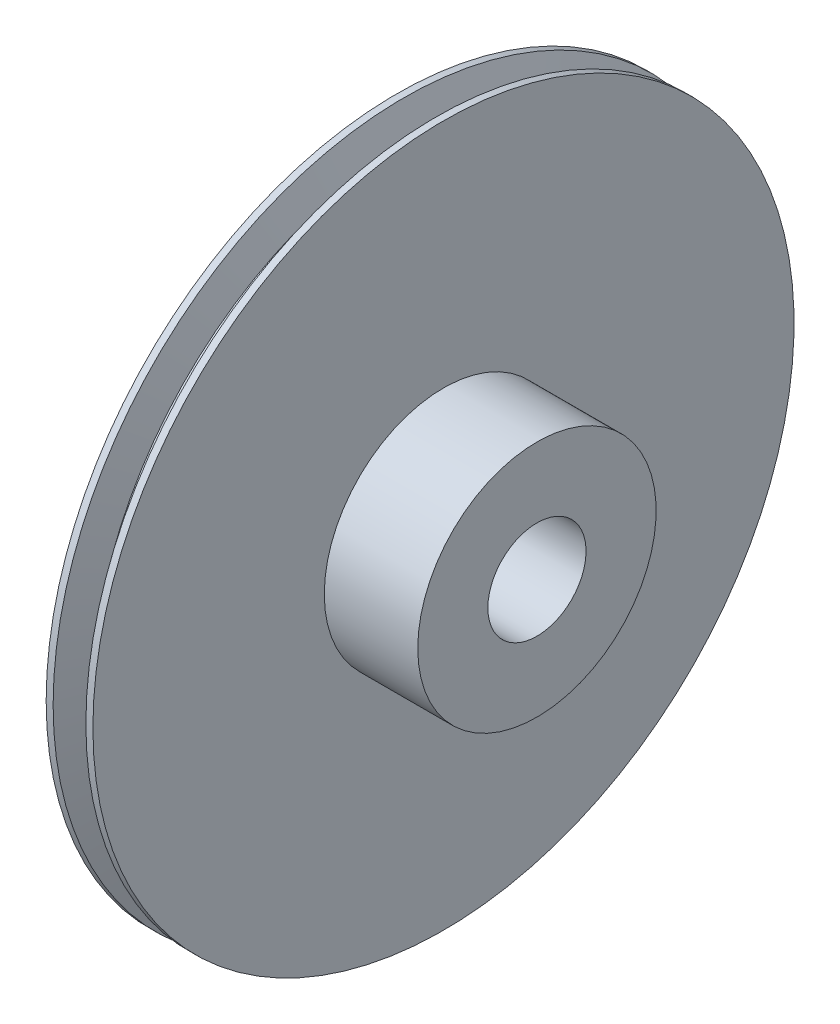
ISO-10303-21;
HEADER;
FILE_DESCRIPTION(('STEP AP214'),'2;1');
FILE_NAME('part.step','',(''),(''),'','','');
FILE_SCHEMA(('AUTOMOTIVE_DESIGN { 1 0 10303 214 1 1 1 1 }'));
ENDSEC;
DATA;
#1=APPLICATION_CONTEXT('core data for automotive mechanical design processes');
#2=APPLICATION_PROTOCOL_DEFINITION('international standard','automotive_design',2000,#1);
#3=PRODUCT_CONTEXT('',#1,'mechanical');
#4=PRODUCT('Part','Part','',(#3));
#5=PRODUCT_RELATED_PRODUCT_CATEGORY('part','',(#4));
#6=PRODUCT_DEFINITION_FORMATION('','',#4);
#7=PRODUCT_DEFINITION_CONTEXT('part definition',#1,'design');
#8=PRODUCT_DEFINITION('design','',#6,#7);
#9=PRODUCT_DEFINITION_SHAPE('','',#8);
#10=(LENGTH_UNIT() NAMED_UNIT(*) SI_UNIT(.MILLI.,.METRE.));
#11=(NAMED_UNIT(*) PLANE_ANGLE_UNIT() SI_UNIT($,.RADIAN.));
#12=(NAMED_UNIT(*) SI_UNIT($,.STERADIAN.) SOLID_ANGLE_UNIT());
#13=UNCERTAINTY_MEASURE_WITH_UNIT(LENGTH_MEASURE(1.E-05),#10,'distance_accuracy_value','');
#14=(GEOMETRIC_REPRESENTATION_CONTEXT(3) GLOBAL_UNCERTAINTY_ASSIGNED_CONTEXT((#13)) GLOBAL_UNIT_ASSIGNED_CONTEXT((#10,
#11,#12)) REPRESENTATION_CONTEXT('',''));
#15=CARTESIAN_POINT('',(0.,0.,0.));
#16=DIRECTION('',(0.,0.,1.));
#17=DIRECTION('',(1.,0.,0.));
#18=AXIS2_PLACEMENT_3D('',#15,#16,#17);
#19=CARTESIAN_POINT('',(0.,0.,0.));
#20=DIRECTION('',(-1.,0.,0.));
#21=DIRECTION('',(0.,0.,1.));
#22=AXIS2_PLACEMENT_3D('',#19,#20,#21);
#23=CYLINDRICAL_SURFACE('',#22,10.5);
#24=CARTESIAN_POINT('',(30.,0.,0.));
#25=DIRECTION('',(-1.,0.,0.));
#26=DIRECTION('',(0.,0.,1.));
#27=AXIS2_PLACEMENT_3D('',#24,#25,#26);
#28=CIRCLE('',#27,10.5);
#29=CARTESIAN_POINT('',(30.,0.,10.5));
#30=VERTEX_POINT('',#29);
#31=EDGE_CURVE('E84',#30,#30,#28,.T.);
#32=ORIENTED_EDGE('',*,*,#31,.F.);
#33=EDGE_LOOP('',(#32));
#34=FACE_BOUND('',#33,.T.);
#35=CARTESIAN_POINT('',(0.,0.,0.));
#36=DIRECTION('',(-1.,0.,0.));
#37=DIRECTION('',(0.,0.,1.));
#38=AXIS2_PLACEMENT_3D('',#35,#36,#37);
#39=CIRCLE('',#38,10.5);
#40=CARTESIAN_POINT('',(0.,0.,10.5));
#41=VERTEX_POINT('',#40);
#42=EDGE_CURVE('E10',#41,#41,#39,.T.);
#43=ORIENTED_EDGE('',*,*,#42,.T.);
#44=EDGE_LOOP('',(#43));
#45=FACE_BOUND('',#44,.T.);
#46=ADVANCED_FACE('F41',(#34,#45),#23,.F.);
#47=CARTESIAN_POINT('',(0.,10.5,0.));
#48=DIRECTION('',(1.,0.,0.));
#49=DIRECTION('',(0.,0.,-1.));
#50=AXIS2_PLACEMENT_3D('',#47,#48,#49);
#51=PLANE('',#50);
#52=ORIENTED_EDGE('',*,*,#42,.F.);
#53=EDGE_LOOP('',(#52));
#54=FACE_BOUND('',#53,.T.);
#55=CARTESIAN_POINT('',(0.,0.,0.));
#56=DIRECTION('',(-1.,0.,0.));
#57=DIRECTION('',(0.,0.,1.));
#58=AXIS2_PLACEMENT_3D('',#55,#56,#57);
#59=CIRCLE('',#58,75.);
#60=CARTESIAN_POINT('',(0.,0.,75.));
#61=VERTEX_POINT('',#60);
#62=EDGE_CURVE('E48',#61,#61,#59,.T.);
#63=ORIENTED_EDGE('',*,*,#62,.T.);
#64=EDGE_LOOP('',(#63));
#65=FACE_BOUND('',#64,.T.);
#66=ADVANCED_FACE('F92',(#54,#65),#51,.F.);
#67=CARTESIAN_POINT('',(0.,0.,0.));
#68=DIRECTION('',(-1.,0.,0.));
#69=DIRECTION('',(0.,0.,1.));
#70=AXIS2_PLACEMENT_3D('',#67,#68,#69);
#71=CYLINDRICAL_SURFACE('',#70,75.);
#72=ORIENTED_EDGE('',*,*,#62,.F.);
#73=EDGE_LOOP('',(#72));
#74=FACE_BOUND('',#73,.T.);
#75=CARTESIAN_POINT('',(1.48948448929091,0.,0.));
#76=DIRECTION('',(-1.,0.,0.));
#77=DIRECTION('',(0.,0.,1.));
#78=AXIS2_PLACEMENT_3D('',#75,#76,#77);
#79=CIRCLE('',#78,75.);
#80=CARTESIAN_POINT('',(1.48948448929091,0.,75.));
#81=VERTEX_POINT('',#80);
#82=EDGE_CURVE('E53',#81,#81,#79,.T.);
#83=ORIENTED_EDGE('',*,*,#82,.T.);
#84=EDGE_LOOP('',(#83));
#85=FACE_BOUND('',#84,.T.);
#86=ADVANCED_FACE('F96',(#74,#85),#71,.T.);
#87=CARTESIAN_POINT('',(3.8197356203277,0.,0.));
#88=DIRECTION('',(-1.,0.,0.));
#89=DIRECTION('',(0.,0.,1.));
#90=AXIS2_PLACEMENT_3D('',#87,#88,#89);
#91=CONICAL_SURFACE('',#90,68.9271971784336,1.20440341121144);
#92=ORIENTED_EDGE('',*,*,#82,.F.);
#93=EDGE_LOOP('',(#92));
#94=FACE_BOUND('',#93,.T.);
#95=CARTESIAN_POINT('',(3.8197356203277,0.,0.));
#96=DIRECTION('',(-1.,0.,0.));
#97=DIRECTION('',(0.,0.,1.));
#98=AXIS2_PLACEMENT_3D('',#95,#96,#97);
#99=CIRCLE('',#98,68.9271971784336);
#100=CARTESIAN_POINT('',(3.8197356203277,0.,68.9271971784336));
#101=VERTEX_POINT('',#100);
#102=EDGE_CURVE('E58',#101,#101,#99,.T.);
#103=ORIENTED_EDGE('',*,*,#102,.T.);
#104=EDGE_LOOP('',(#103));
#105=FACE_BOUND('',#104,.T.);
#106=ADVANCED_FACE('F101',(#94,#105),#91,.T.);
#107=CARTESIAN_POINT('',(0.,0.,0.));
#108=DIRECTION('',(-1.,0.,0.));
#109=DIRECTION('',(0.,0.,1.));
#110=AXIS2_PLACEMENT_3D('',#107,#108,#109);
#111=CYLINDRICAL_SURFACE('',#110,68.9271971784336);
#112=ORIENTED_EDGE('',*,*,#102,.F.);
#113=EDGE_LOOP('',(#112));
#114=FACE_BOUND('',#113,.T.);
#115=CARTESIAN_POINT('',(6.18026437967229,0.,0.));
#116=DIRECTION('',(-1.,0.,0.));
#117=DIRECTION('',(0.,0.,1.));
#118=AXIS2_PLACEMENT_3D('',#115,#116,#117);
#119=CIRCLE('',#118,68.9271971784336);
#120=CARTESIAN_POINT('',(6.18026437967229,0.,68.9271971784336));
#121=VERTEX_POINT('',#120);
#122=EDGE_CURVE('E64',#121,#121,#119,.T.);
#123=ORIENTED_EDGE('',*,*,#122,.T.);
#124=EDGE_LOOP('',(#123));
#125=FACE_BOUND('',#124,.T.);
#126=ADVANCED_FACE('F107',(#114,#125),#111,.T.);
#127=CARTESIAN_POINT('',(8.49596584454411,0.,0.));
#128=DIRECTION('',(1.,0.,0.));
#129=DIRECTION('',(0.,0.,-1.));
#130=AXIS2_PLACEMENT_3D('',#127,#128,#129);
#131=CONICAL_SURFACE('',#130,75.,1.20649346244589);
#132=ORIENTED_EDGE('',*,*,#122,.F.);
#133=EDGE_LOOP('',(#132));
#134=FACE_BOUND('',#133,.T.);
#135=CARTESIAN_POINT('',(8.49596584454411,0.,0.));
#136=DIRECTION('',(-1.,0.,0.));
#137=DIRECTION('',(0.,0.,1.));
#138=AXIS2_PLACEMENT_3D('',#135,#136,#137);
#139=CIRCLE('',#138,75.);
#140=CARTESIAN_POINT('',(8.49596584454411,0.,75.));
#141=VERTEX_POINT('',#140);
#142=EDGE_CURVE('E68',#141,#141,#139,.T.);
#143=ORIENTED_EDGE('',*,*,#142,.T.);
#144=EDGE_LOOP('',(#143));
#145=FACE_BOUND('',#144,.T.);
#146=ADVANCED_FACE('F111',(#134,#145),#131,.T.);
#147=CARTESIAN_POINT('',(0.,0.,0.));
#148=DIRECTION('',(-1.,0.,0.));
#149=DIRECTION('',(0.,0.,1.));
#150=AXIS2_PLACEMENT_3D('',#147,#148,#149);
#151=CYLINDRICAL_SURFACE('',#150,75.);
#152=ORIENTED_EDGE('',*,*,#142,.F.);
#153=EDGE_LOOP('',(#152));
#154=FACE_BOUND('',#153,.T.);
#155=CARTESIAN_POINT('',(9.99999999999999,0.,0.));
#156=DIRECTION('',(-1.,0.,0.));
#157=DIRECTION('',(0.,0.,1.));
#158=AXIS2_PLACEMENT_3D('',#155,#156,#157);
#159=CIRCLE('',#158,75.);
#160=CARTESIAN_POINT('',(9.99999999999999,0.,75.));
#161=VERTEX_POINT('',#160);
#162=EDGE_CURVE('E72',#161,#161,#159,.T.);
#163=ORIENTED_EDGE('',*,*,#162,.T.);
#164=EDGE_LOOP('',(#163));
#165=FACE_BOUND('',#164,.T.);
#166=ADVANCED_FACE('F115',(#154,#165),#151,.T.);
#167=CARTESIAN_POINT('',(9.99999999999999,75.,0.));
#168=DIRECTION('',(-1.,0.,0.));
#169=DIRECTION('',(0.,0.,1.));
#170=AXIS2_PLACEMENT_3D('',#167,#168,#169);
#171=PLANE('',#170);
#172=ORIENTED_EDGE('',*,*,#162,.F.);
#173=EDGE_LOOP('',(#172));
#174=FACE_BOUND('',#173,.T.);
#175=CARTESIAN_POINT('',(9.99999999999999,0.,0.));
#176=DIRECTION('',(-1.,0.,0.));
#177=DIRECTION('',(0.,0.,1.));
#178=AXIS2_PLACEMENT_3D('',#175,#176,#177);
#179=CIRCLE('',#178,25.5);
#180=CARTESIAN_POINT('',(9.99999999999999,0.,25.5));
#181=VERTEX_POINT('',#180);
#182=EDGE_CURVE('E76',#181,#181,#179,.T.);
#183=ORIENTED_EDGE('',*,*,#182,.T.);
#184=EDGE_LOOP('',(#183));
#185=FACE_BOUND('',#184,.T.);
#186=ADVANCED_FACE('F119',(#174,#185),#171,.F.);
#187=CARTESIAN_POINT('',(0.,0.,0.));
#188=DIRECTION('',(-1.,0.,0.));
#189=DIRECTION('',(0.,0.,1.));
#190=AXIS2_PLACEMENT_3D('',#187,#188,#189);
#191=CYLINDRICAL_SURFACE('',#190,25.5);
#192=ORIENTED_EDGE('',*,*,#182,.F.);
#193=EDGE_LOOP('',(#192));
#194=FACE_BOUND('',#193,.T.);
#195=CARTESIAN_POINT('',(30.,0.,0.));
#196=DIRECTION('',(-1.,0.,0.));
#197=DIRECTION('',(0.,0.,1.));
#198=AXIS2_PLACEMENT_3D('',#195,#196,#197);
#199=CIRCLE('',#198,25.5);
#200=CARTESIAN_POINT('',(30.,0.,25.5));
#201=VERTEX_POINT('',#200);
#202=EDGE_CURVE('E80',#201,#201,#199,.T.);
#203=ORIENTED_EDGE('',*,*,#202,.T.);
#204=EDGE_LOOP('',(#203));
#205=FACE_BOUND('',#204,.T.);
#206=ADVANCED_FACE('F123',(#194,#205),#191,.T.);
#207=CARTESIAN_POINT('',(30.,25.5,0.));
#208=DIRECTION('',(-1.,0.,0.));
#209=DIRECTION('',(0.,0.,1.));
#210=AXIS2_PLACEMENT_3D('',#207,#208,#209);
#211=PLANE('',#210);
#212=ORIENTED_EDGE('',*,*,#202,.F.);
#213=EDGE_LOOP('',(#212));
#214=FACE_BOUND('',#213,.T.);
#215=ORIENTED_EDGE('',*,*,#31,.T.);
#216=EDGE_LOOP('',(#215));
#217=FACE_BOUND('',#216,.T.);
#218=ADVANCED_FACE('F89',(#214,#217),#211,.F.);
#219=CLOSED_SHELL('',(#46,#66,#86,#106,#126,#146,#166,#186,#206,#218));
#220=MANIFOLD_SOLID_BREP('B2',#219);
#221=ADVANCED_BREP_SHAPE_REPRESENTATION('',(#18,#220),#14);
#222=SHAPE_DEFINITION_REPRESENTATION(#9,#221);
ENDSEC;
END-ISO-10303-21;
